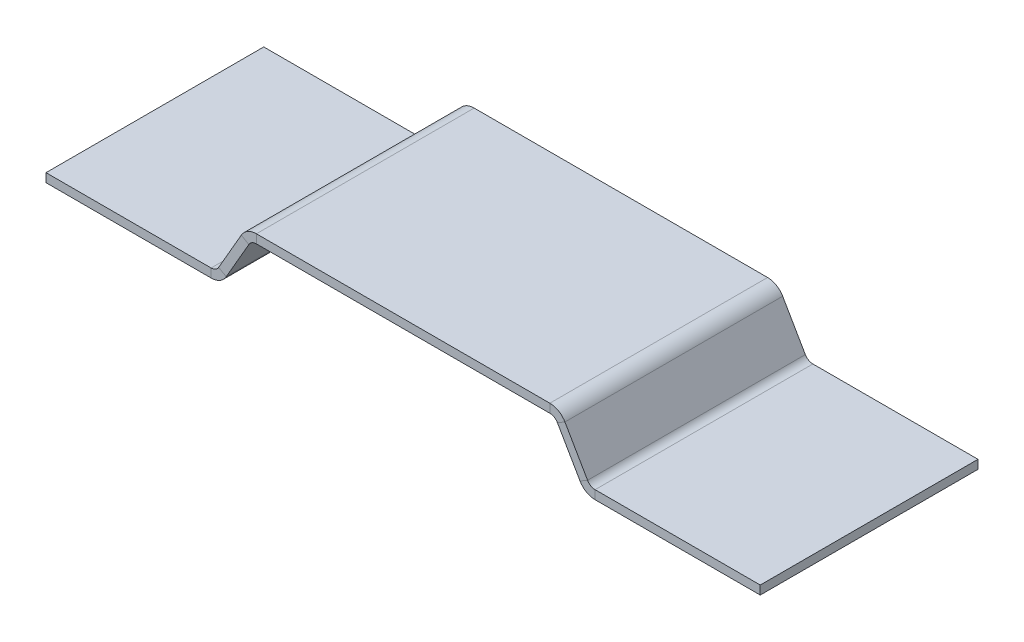
ISO-10303-21;
HEADER;
FILE_DESCRIPTION(('STEP AP214'),'2;1');
FILE_NAME('part.step','',(''),(''),'','','');
FILE_SCHEMA(('AUTOMOTIVE_DESIGN { 1 0 10303 214 1 1 1 1 }'));
ENDSEC;
DATA;
#1=APPLICATION_CONTEXT('core data for automotive mechanical design processes');
#2=APPLICATION_PROTOCOL_DEFINITION('international standard','automotive_design',2000,#1);
#3=PRODUCT_CONTEXT('',#1,'mechanical');
#4=PRODUCT('Part','Part','',(#3));
#5=PRODUCT_RELATED_PRODUCT_CATEGORY('part','',(#4));
#6=PRODUCT_DEFINITION_FORMATION('','',#4);
#7=PRODUCT_DEFINITION_CONTEXT('part definition',#1,'design');
#8=PRODUCT_DEFINITION('design','',#6,#7);
#9=PRODUCT_DEFINITION_SHAPE('','',#8);
#10=(LENGTH_UNIT() NAMED_UNIT(*) SI_UNIT(.MILLI.,.METRE.));
#11=(NAMED_UNIT(*) PLANE_ANGLE_UNIT() SI_UNIT($,.RADIAN.));
#12=(NAMED_UNIT(*) SI_UNIT($,.STERADIAN.) SOLID_ANGLE_UNIT());
#13=UNCERTAINTY_MEASURE_WITH_UNIT(LENGTH_MEASURE(1.E-05),#10,'distance_accuracy_value','');
#14=(GEOMETRIC_REPRESENTATION_CONTEXT(3) GLOBAL_UNCERTAINTY_ASSIGNED_CONTEXT((#13)) GLOBAL_UNIT_ASSIGNED_CONTEXT((#10,
#11,#12)) REPRESENTATION_CONTEXT('',''));
#15=CARTESIAN_POINT('',(0.,0.,0.));
#16=DIRECTION('',(0.,0.,1.));
#17=DIRECTION('',(1.,0.,0.));
#18=AXIS2_PLACEMENT_3D('',#15,#16,#17);
#19=CARTESIAN_POINT('',(220.414518843274,0.,125.));
#20=DIRECTION('',(0.,0.,1.));
#21=DIRECTION('',(1.,0.,0.));
#22=AXIS2_PLACEMENT_3D('',#19,#20,#21);
#23=PLANE('',#22);
#24=DIRECTION('',(0.,-1.,0.));
#25=VECTOR('',#24,1.);
#26=CARTESIAN_POINT('',(220.414518843274,0.,125.));
#27=LINE('',#26,#25);
#28=CARTESIAN_POINT('',(220.414518843274,0.,125.));
#29=VERTEX_POINT('',#28);
#30=CARTESIAN_POINT('',(220.414518843274,-9.99999999999994,125.));
#31=VERTEX_POINT('',#30);
#32=EDGE_CURVE('E11',#29,#31,#27,.T.);
#33=ORIENTED_EDGE('',*,*,#32,.F.);
#34=CARTESIAN_POINT('',(220.414518843274,10.0000000000001,125.));
#35=DIRECTION('',(0.,0.,1.));
#36=DIRECTION('',(1.,0.,0.));
#37=AXIS2_PLACEMENT_3D('',#34,#35,#36);
#38=CIRCLE('',#37,10.);
#39=CARTESIAN_POINT('',(211.754264805429,5.00000000000007,125.));
#40=VERTEX_POINT('',#39);
#41=EDGE_CURVE('E363',#29,#40,#38,.F.);
#42=ORIENTED_EDGE('',*,*,#41,.T.);
#43=DIRECTION('',(0.86602540378444,0.499999999999998,0.));
#44=VECTOR('',#43,1.);
#45=CARTESIAN_POINT('',(203.094010767585,0.,125.));
#46=LINE('',#45,#44);
#47=CARTESIAN_POINT('',(203.094010767585,0.,125.));
#48=VERTEX_POINT('',#47);
#49=EDGE_CURVE('E46',#48,#40,#46,.T.);
#50=ORIENTED_EDGE('',*,*,#49,.F.);
#51=CARTESIAN_POINT('',(220.414518843274,10.0000000000001,125.));
#52=DIRECTION('',(0.,0.,1.));
#53=DIRECTION('',(1.,0.,0.));
#54=AXIS2_PLACEMENT_3D('',#51,#52,#53);
#55=CIRCLE('',#54,20.);
#56=EDGE_CURVE('E438',#31,#48,#55,.F.);
#57=ORIENTED_EDGE('',*,*,#56,.F.);
#58=EDGE_LOOP('',(#33,#42,#50,#57));
#59=FACE_BOUND('',#58,.T.);
#60=ADVANCED_FACE('F38',(#59),#23,.T.);
#61=CARTESIAN_POINT('',(203.094010767585,0.,125.));
#62=DIRECTION('',(0.,0.,1.));
#63=DIRECTION('',(1.,0.,0.));
#64=AXIS2_PLACEMENT_3D('',#61,#62,#63);
#65=PLANE('',#64);
#66=DIRECTION('',(-1.,0.,0.));
#67=VECTOR('',#66,1.);
#68=CARTESIAN_POINT('',(214.641016151377,0.,125.));
#69=LINE('',#68,#67);
#70=CARTESIAN_POINT('',(410.,0.,125.));
#71=VERTEX_POINT('',#70);
#72=EDGE_CURVE('E367',#71,#29,#69,.T.);
#73=ORIENTED_EDGE('',*,*,#72,.T.);
#74=ORIENTED_EDGE('',*,*,#32,.T.);
#75=DIRECTION('',(-1.,0.,0.));
#76=VECTOR('',#75,1.);
#77=CARTESIAN_POINT('',(214.641016151377,-9.99999999999995,125.));
#78=LINE('',#77,#76);
#79=CARTESIAN_POINT('',(410.,-9.99999999999992,125.));
#80=VERTEX_POINT('',#79);
#81=EDGE_CURVE('E440',#80,#31,#78,.T.);
#82=ORIENTED_EDGE('',*,*,#81,.F.);
#83=DIRECTION('',(0.,-1.,0.));
#84=VECTOR('',#83,1.);
#85=CARTESIAN_POINT('',(410.,0.,125.));
#86=LINE('',#85,#84);
#87=EDGE_CURVE('E443',#71,#80,#86,.T.);
#88=ORIENTED_EDGE('',*,*,#87,.F.);
#89=EDGE_LOOP('',(#73,#74,#82,#88));
#90=FACE_BOUND('',#89,.T.);
#91=ADVANCED_FACE('F449',(#90),#65,.T.);
#92=CARTESIAN_POINT('',(211.754264805429,5.00000000000007,-125.));
#93=DIRECTION('',(0.,0.,-1.));
#94=DIRECTION('',(-1.,0.,0.));
#95=AXIS2_PLACEMENT_3D('',#92,#93,#94);
#96=PLANE('',#95);
#97=DIRECTION('',(-0.86602540378444,-0.499999999999998,0.));
#98=VECTOR('',#97,1.);
#99=CARTESIAN_POINT('',(211.754264805429,5.00000000000007,-125.));
#100=LINE('',#99,#98);
#101=CARTESIAN_POINT('',(211.754264805429,5.00000000000007,-125.));
#102=VERTEX_POINT('',#101);
#103=CARTESIAN_POINT('',(203.094010767585,0.,-125.));
#104=VERTEX_POINT('',#103);
#105=EDGE_CURVE('E347',#102,#104,#100,.T.);
#106=ORIENTED_EDGE('',*,*,#105,.F.);
#107=CARTESIAN_POINT('',(220.414518843274,10.0000000000001,-125.));
#108=DIRECTION('',(0.,0.,1.));
#109=DIRECTION('',(1.,0.,0.));
#110=AXIS2_PLACEMENT_3D('',#107,#108,#109);
#111=CIRCLE('',#110,10.);
#112=CARTESIAN_POINT('',(220.414518843274,0.,-125.));
#113=VERTEX_POINT('',#112);
#114=EDGE_CURVE('E263',#113,#102,#111,.F.);
#115=ORIENTED_EDGE('',*,*,#114,.F.);
#116=DIRECTION('',(0.,1.,0.));
#117=VECTOR('',#116,1.);
#118=CARTESIAN_POINT('',(220.414518843274,-9.99999999999994,-125.));
#119=LINE('',#118,#117);
#120=CARTESIAN_POINT('',(220.414518843274,-9.99999999999994,-125.));
#121=VERTEX_POINT('',#120);
#122=EDGE_CURVE('E345',#121,#113,#119,.T.);
#123=ORIENTED_EDGE('',*,*,#122,.F.);
#124=CARTESIAN_POINT('',(220.414518843274,10.0000000000001,-125.));
#125=DIRECTION('',(0.,0.,1.));
#126=DIRECTION('',(1.,0.,0.));
#127=AXIS2_PLACEMENT_3D('',#124,#125,#126);
#128=CIRCLE('',#127,20.);
#129=EDGE_CURVE('E251',#121,#104,#128,.F.);
#130=ORIENTED_EDGE('',*,*,#129,.T.);
#131=EDGE_LOOP('',(#106,#115,#123,#130));
#132=FACE_BOUND('',#131,.T.);
#133=ADVANCED_FACE('F456',(#132),#96,.T.);
#134=CARTESIAN_POINT('',(220.414518843274,-9.99999999999994,-125.));
#135=DIRECTION('',(0.,0.,-1.));
#136=DIRECTION('',(-1.,0.,0.));
#137=AXIS2_PLACEMENT_3D('',#134,#135,#136);
#138=PLANE('',#137);
#139=DIRECTION('',(-0.499999999999998,0.86602540378444,0.));
#140=VECTOR('',#139,1.);
#141=CARTESIAN_POINT('',(180.,60.,-125.));
#142=LINE('',#141,#140);
#143=CARTESIAN_POINT('',(185.773502691896,50.,-125.));
#144=VERTEX_POINT('',#143);
#145=EDGE_CURVE('E266',#102,#144,#142,.T.);
#146=ORIENTED_EDGE('',*,*,#145,.F.);
#147=ORIENTED_EDGE('',*,*,#105,.T.);
#148=DIRECTION('',(-0.499999999999998,0.86602540378444,0.));
#149=VECTOR('',#148,1.);
#150=CARTESIAN_POINT('',(171.339745962156,55.0000000000001,-125.));
#151=LINE('',#150,#149);
#152=CARTESIAN_POINT('',(177.113248654052,45.,-125.));
#153=VERTEX_POINT('',#152);
#154=EDGE_CURVE('E248',#104,#153,#151,.T.);
#155=ORIENTED_EDGE('',*,*,#154,.T.);
#156=DIRECTION('',(0.86602540378444,0.499999999999998,0.));
#157=VECTOR('',#156,1.);
#158=CARTESIAN_POINT('',(177.113248654052,45.,-125.));
#159=LINE('',#158,#157);
#160=EDGE_CURVE('E337',#153,#144,#159,.T.);
#161=ORIENTED_EDGE('',*,*,#160,.T.);
#162=EDGE_LOOP('',(#146,#147,#155,#161));
#163=FACE_BOUND('',#162,.T.);
#164=ADVANCED_FACE('F459',(#163),#138,.T.);
#165=CARTESIAN_POINT('',(185.773502691896,50.,125.));
#166=DIRECTION('',(0.,0.,1.));
#167=DIRECTION('',(1.,0.,0.));
#168=AXIS2_PLACEMENT_3D('',#165,#166,#167);
#169=PLANE('',#168);
#170=DIRECTION('',(-0.86602540378444,-0.499999999999998,0.));
#171=VECTOR('',#170,1.);
#172=CARTESIAN_POINT('',(185.773502691896,50.,125.));
#173=LINE('',#172,#171);
#174=CARTESIAN_POINT('',(185.773502691896,50.,125.));
#175=VERTEX_POINT('',#174);
#176=CARTESIAN_POINT('',(177.113248654052,45.,125.));
#177=VERTEX_POINT('',#176);
#178=EDGE_CURVE('E343',#175,#177,#173,.T.);
#179=ORIENTED_EDGE('',*,*,#178,.F.);
#180=CARTESIAN_POINT('',(168.452994616207,40.,125.));
#181=DIRECTION('',(0.,0.,-1.));
#182=DIRECTION('',(-1.,0.,0.));
#183=AXIS2_PLACEMENT_3D('',#180,#181,#182);
#184=CIRCLE('',#183,20.);
#185=CARTESIAN_POINT('',(168.452994616207,60.,125.));
#186=VERTEX_POINT('',#185);
#187=EDGE_CURVE('E375',#175,#186,#184,.F.);
#188=ORIENTED_EDGE('',*,*,#187,.T.);
#189=DIRECTION('',(0.,1.,0.));
#190=VECTOR('',#189,1.);
#191=CARTESIAN_POINT('',(168.452994616207,50.,125.));
#192=LINE('',#191,#190);
#193=CARTESIAN_POINT('',(168.452994616207,50.,125.));
#194=VERTEX_POINT('',#193);
#195=EDGE_CURVE('E341',#194,#186,#192,.T.);
#196=ORIENTED_EDGE('',*,*,#195,.F.);
#197=CARTESIAN_POINT('',(168.452994616207,40.,125.));
#198=DIRECTION('',(0.,0.,1.));
#199=DIRECTION('',(1.,0.,0.));
#200=AXIS2_PLACEMENT_3D('',#197,#198,#199);
#201=CIRCLE('',#200,10.);
#202=EDGE_CURVE('E434',#177,#194,#201,.T.);
#203=ORIENTED_EDGE('',*,*,#202,.F.);
#204=EDGE_LOOP('',(#179,#188,#196,#203));
#205=FACE_BOUND('',#204,.T.);
#206=ADVANCED_FACE('F479',(#205),#169,.T.);
#207=CARTESIAN_POINT('',(168.452994616207,50.,125.));
#208=DIRECTION('',(0.,0.,1.));
#209=DIRECTION('',(1.,0.,0.));
#210=AXIS2_PLACEMENT_3D('',#207,#208,#209);
#211=PLANE('',#210);
#212=DIRECTION('',(-0.499999999999998,0.86602540378444,0.));
#213=VECTOR('',#212,1.);
#214=CARTESIAN_POINT('',(180.,60.,125.));
#215=LINE('',#214,#213);
#216=EDGE_CURVE('E354',#40,#175,#215,.T.);
#217=ORIENTED_EDGE('',*,*,#216,.T.);
#218=ORIENTED_EDGE('',*,*,#178,.T.);
#219=DIRECTION('',(-0.499999999999998,0.86602540378444,0.));
#220=VECTOR('',#219,1.);
#221=CARTESIAN_POINT('',(171.339745962156,55.0000000000001,125.));
#222=LINE('',#221,#220);
#223=EDGE_CURVE('E357',#48,#177,#222,.T.);
#224=ORIENTED_EDGE('',*,*,#223,.F.);
#225=ORIENTED_EDGE('',*,*,#49,.T.);
#226=EDGE_LOOP('',(#217,#218,#224,#225));
#227=FACE_BOUND('',#226,.T.);
#228=ADVANCED_FACE('F352',(#227),#211,.T.);
#229=CARTESIAN_POINT('',(168.452994616207,60.,-125.));
#230=DIRECTION('',(0.,0.,-1.));
#231=DIRECTION('',(-1.,0.,0.));
#232=AXIS2_PLACEMENT_3D('',#229,#230,#231);
#233=PLANE('',#232);
#234=DIRECTION('',(0.,-1.,0.));
#235=VECTOR('',#234,1.);
#236=CARTESIAN_POINT('',(168.452994616207,60.,-125.));
#237=LINE('',#236,#235);
#238=CARTESIAN_POINT('',(168.452994616207,60.,-125.));
#239=VERTEX_POINT('',#238);
#240=CARTESIAN_POINT('',(168.452994616207,50.,-125.));
#241=VERTEX_POINT('',#240);
#242=EDGE_CURVE('E339',#239,#241,#237,.T.);
#243=ORIENTED_EDGE('',*,*,#242,.F.);
#244=CARTESIAN_POINT('',(168.452994616207,40.,-125.));
#245=DIRECTION('',(0.,0.,-1.));
#246=DIRECTION('',(-1.,0.,0.));
#247=AXIS2_PLACEMENT_3D('',#244,#245,#246);
#248=CIRCLE('',#247,20.);
#249=EDGE_CURVE('E269',#144,#239,#248,.F.);
#250=ORIENTED_EDGE('',*,*,#249,.F.);
#251=ORIENTED_EDGE('',*,*,#160,.F.);
#252=CARTESIAN_POINT('',(168.452994616207,40.,-125.));
#253=DIRECTION('',(0.,0.,1.));
#254=DIRECTION('',(1.,0.,0.));
#255=AXIS2_PLACEMENT_3D('',#252,#253,#254);
#256=CIRCLE('',#255,10.);
#257=EDGE_CURVE('E245',#153,#241,#256,.T.);
#258=ORIENTED_EDGE('',*,*,#257,.T.);
#259=EDGE_LOOP('',(#243,#250,#251,#258));
#260=FACE_BOUND('',#259,.T.);
#261=ADVANCED_FACE('F473',(#260),#233,.T.);
#262=CARTESIAN_POINT('',(177.113248654052,45.,-125.));
#263=DIRECTION('',(0.,0.,-1.));
#264=DIRECTION('',(-1.,0.,0.));
#265=AXIS2_PLACEMENT_3D('',#262,#263,#264);
#266=PLANE('',#265);
#267=DIRECTION('',(-1.,0.,0.));
#268=VECTOR('',#267,1.);
#269=CARTESIAN_POINT('',(-180.,60.,-125.));
#270=LINE('',#269,#268);
#271=CARTESIAN_POINT('',(-168.452994616207,60.,-125.));
#272=VERTEX_POINT('',#271);
#273=EDGE_CURVE('E272',#239,#272,#270,.T.);
#274=ORIENTED_EDGE('',*,*,#273,.F.);
#275=ORIENTED_EDGE('',*,*,#242,.T.);
#276=DIRECTION('',(-1.,0.,0.));
#277=VECTOR('',#276,1.);
#278=CARTESIAN_POINT('',(-180.,50.,-125.));
#279=LINE('',#278,#277);
#280=CARTESIAN_POINT('',(-168.452994616207,50.,-125.));
#281=VERTEX_POINT('',#280);
#282=EDGE_CURVE('E242',#241,#281,#279,.T.);
#283=ORIENTED_EDGE('',*,*,#282,.T.);
#284=DIRECTION('',(0.,1.,0.));
#285=VECTOR('',#284,1.);
#286=CARTESIAN_POINT('',(-168.452994616207,50.,-125.));
#287=LINE('',#286,#285);
#288=EDGE_CURVE('E333',#281,#272,#287,.T.);
#289=ORIENTED_EDGE('',*,*,#288,.T.);
#290=EDGE_LOOP('',(#274,#275,#283,#289));
#291=FACE_BOUND('',#290,.T.);
#292=ADVANCED_FACE('F483',(#291),#266,.T.);
#293=CARTESIAN_POINT('',(-168.452994616207,60.,125.));
#294=DIRECTION('',(0.,0.,1.));
#295=DIRECTION('',(1.,0.,0.));
#296=AXIS2_PLACEMENT_3D('',#293,#294,#295);
#297=PLANE('',#296);
#298=DIRECTION('',(0.,-1.,0.));
#299=VECTOR('',#298,1.);
#300=CARTESIAN_POINT('',(-168.452994616207,60.,125.));
#301=LINE('',#300,#299);
#302=CARTESIAN_POINT('',(-168.452994616207,60.,125.));
#303=VERTEX_POINT('',#302);
#304=CARTESIAN_POINT('',(-168.452994616207,50.,125.));
#305=VERTEX_POINT('',#304);
#306=EDGE_CURVE('E195',#303,#305,#301,.T.);
#307=ORIENTED_EDGE('',*,*,#306,.F.);
#308=CARTESIAN_POINT('',(-168.452994616207,40.,125.));
#309=DIRECTION('',(0.,0.,-1.));
#310=DIRECTION('',(-1.,0.,0.));
#311=AXIS2_PLACEMENT_3D('',#308,#309,#310);
#312=CIRCLE('',#311,20.);
#313=CARTESIAN_POINT('',(-185.773502691896,50.,125.));
#314=VERTEX_POINT('',#313);
#315=EDGE_CURVE('E199',#303,#314,#312,.F.);
#316=ORIENTED_EDGE('',*,*,#315,.T.);
#317=DIRECTION('',(-0.86602540378444,0.499999999999998,0.));
#318=VECTOR('',#317,1.);
#319=CARTESIAN_POINT('',(-177.113248654052,45.,125.));
#320=LINE('',#319,#318);
#321=CARTESIAN_POINT('',(-177.113248654052,45.,125.));
#322=VERTEX_POINT('',#321);
#323=EDGE_CURVE('E183',#322,#314,#320,.T.);
#324=ORIENTED_EDGE('',*,*,#323,.F.);
#325=CARTESIAN_POINT('',(-168.452994616207,40.,125.));
#326=DIRECTION('',(0.,0.,1.));
#327=DIRECTION('',(1.,0.,0.));
#328=AXIS2_PLACEMENT_3D('',#325,#326,#327);
#329=CIRCLE('',#328,10.);
#330=EDGE_CURVE('E396',#305,#322,#329,.T.);
#331=ORIENTED_EDGE('',*,*,#330,.F.);
#332=EDGE_LOOP('',(#307,#316,#324,#331));
#333=FACE_BOUND('',#332,.T.);
#334=ADVANCED_FACE('F201',(#333),#297,.T.);
#335=CARTESIAN_POINT('',(-177.113248654052,45.,125.));
#336=DIRECTION('',(0.,0.,1.));
#337=DIRECTION('',(1.,0.,0.));
#338=AXIS2_PLACEMENT_3D('',#335,#336,#337);
#339=PLANE('',#338);
#340=DIRECTION('',(-1.,0.,0.));
#341=VECTOR('',#340,1.);
#342=CARTESIAN_POINT('',(-180.,60.,125.));
#343=LINE('',#342,#341);
#344=EDGE_CURVE('E205',#186,#303,#343,.T.);
#345=ORIENTED_EDGE('',*,*,#344,.T.);
#346=ORIENTED_EDGE('',*,*,#306,.T.);
#347=DIRECTION('',(-1.,0.,0.));
#348=VECTOR('',#347,1.);
#349=CARTESIAN_POINT('',(-180.,50.,125.));
#350=LINE('',#349,#348);
#351=EDGE_CURVE('E431',#194,#305,#350,.T.);
#352=ORIENTED_EDGE('',*,*,#351,.F.);
#353=ORIENTED_EDGE('',*,*,#195,.T.);
#354=EDGE_LOOP('',(#345,#346,#352,#353));
#355=FACE_BOUND('',#354,.T.);
#356=ADVANCED_FACE('F383',(#355),#339,.T.);
#357=CARTESIAN_POINT('',(-185.773502691896,50.,-125.));
#358=DIRECTION('',(0.,0.,-1.));
#359=DIRECTION('',(-1.,0.,0.));
#360=AXIS2_PLACEMENT_3D('',#357,#358,#359);
#361=PLANE('',#360);
#362=DIRECTION('',(0.86602540378444,-0.499999999999998,0.));
#363=VECTOR('',#362,1.);
#364=CARTESIAN_POINT('',(-185.773502691896,50.,-125.));
#365=LINE('',#364,#363);
#366=CARTESIAN_POINT('',(-185.773502691896,50.,-125.));
#367=VERTEX_POINT('',#366);
#368=CARTESIAN_POINT('',(-177.113248654052,45.,-125.));
#369=VERTEX_POINT('',#368);
#370=EDGE_CURVE('E196',#367,#369,#365,.T.);
#371=ORIENTED_EDGE('',*,*,#370,.F.);
#372=CARTESIAN_POINT('',(-168.452994616207,40.,-125.));
#373=DIRECTION('',(0.,0.,-1.));
#374=DIRECTION('',(-1.,0.,0.));
#375=AXIS2_PLACEMENT_3D('',#372,#373,#374);
#376=CIRCLE('',#375,20.);
#377=EDGE_CURVE('E212',#272,#367,#376,.F.);
#378=ORIENTED_EDGE('',*,*,#377,.F.);
#379=ORIENTED_EDGE('',*,*,#288,.F.);
#380=CARTESIAN_POINT('',(-168.452994616207,40.,-125.));
#381=DIRECTION('',(0.,0.,1.));
#382=DIRECTION('',(1.,0.,0.));
#383=AXIS2_PLACEMENT_3D('',#380,#381,#382);
#384=CIRCLE('',#383,10.);
#385=EDGE_CURVE('E239',#281,#369,#384,.T.);
#386=ORIENTED_EDGE('',*,*,#385,.T.);
#387=EDGE_LOOP('',(#371,#378,#379,#386));
#388=FACE_BOUND('',#387,.T.);
#389=ADVANCED_FACE('F390',(#388),#361,.T.);
#390=CARTESIAN_POINT('',(-168.452994616207,50.,-125.));
#391=DIRECTION('',(0.,0.,-1.));
#392=DIRECTION('',(-1.,0.,0.));
#393=AXIS2_PLACEMENT_3D('',#390,#391,#392);
#394=PLANE('',#393);
#395=DIRECTION('',(-0.499999999999998,-0.86602540378444,0.));
#396=VECTOR('',#395,1.);
#397=CARTESIAN_POINT('',(-180.,60.,-125.));
#398=LINE('',#397,#396);
#399=CARTESIAN_POINT('',(-211.754264805429,5.00000000000002,-125.));
#400=VERTEX_POINT('',#399);
#401=EDGE_CURVE('E276',#367,#400,#398,.T.);
#402=ORIENTED_EDGE('',*,*,#401,.F.);
#403=ORIENTED_EDGE('',*,*,#370,.T.);
#404=DIRECTION('',(-0.499999999999998,-0.86602540378444,0.));
#405=VECTOR('',#404,1.);
#406=CARTESIAN_POINT('',(-171.339745962156,55.,-125.));
#407=LINE('',#406,#405);
#408=CARTESIAN_POINT('',(-203.094010767585,0.,-125.));
#409=VERTEX_POINT('',#408);
#410=EDGE_CURVE('E237',#369,#409,#407,.T.);
#411=ORIENTED_EDGE('',*,*,#410,.T.);
#412=DIRECTION('',(-0.86602540378444,0.499999999999998,0.));
#413=VECTOR('',#412,1.);
#414=CARTESIAN_POINT('',(-203.094010767585,0.,-125.));
#415=LINE('',#414,#413);
#416=EDGE_CURVE('E119',#409,#400,#415,.T.);
#417=ORIENTED_EDGE('',*,*,#416,.T.);
#418=EDGE_LOOP('',(#402,#403,#411,#417));
#419=FACE_BOUND('',#418,.T.);
#420=ADVANCED_FACE('F392',(#419),#394,.T.);
#421=CARTESIAN_POINT('',(-211.754264805429,5.00000000000002,125.));
#422=DIRECTION('',(0.,0.,1.));
#423=DIRECTION('',(1.,0.,0.));
#424=AXIS2_PLACEMENT_3D('',#421,#422,#423);
#425=PLANE('',#424);
#426=DIRECTION('',(0.86602540378444,-0.499999999999998,0.));
#427=VECTOR('',#426,1.);
#428=CARTESIAN_POINT('',(-211.754264805429,5.00000000000002,125.));
#429=LINE('',#428,#427);
#430=CARTESIAN_POINT('',(-211.754264805429,5.00000000000002,125.));
#431=VERTEX_POINT('',#430);
#432=CARTESIAN_POINT('',(-203.094010767585,0.,125.));
#433=VERTEX_POINT('',#432);
#434=EDGE_CURVE('E331',#431,#433,#429,.T.);
#435=ORIENTED_EDGE('',*,*,#434,.F.);
#436=CARTESIAN_POINT('',(-220.414518843274,10.,125.));
#437=DIRECTION('',(0.,0.,1.));
#438=DIRECTION('',(1.,0.,0.));
#439=AXIS2_PLACEMENT_3D('',#436,#437,#438);
#440=CIRCLE('',#439,10.);
#441=CARTESIAN_POINT('',(-220.414518843274,0.,125.));
#442=VERTEX_POINT('',#441);
#443=EDGE_CURVE('E220',#431,#442,#440,.F.);
#444=ORIENTED_EDGE('',*,*,#443,.T.);
#445=DIRECTION('',(0.,1.,0.));
#446=VECTOR('',#445,1.);
#447=CARTESIAN_POINT('',(-220.414518843274,-10.,125.));
#448=LINE('',#447,#446);
#449=CARTESIAN_POINT('',(-220.414518843274,-10.,125.));
#450=VERTEX_POINT('',#449);
#451=EDGE_CURVE('E54',#450,#442,#448,.T.);
#452=ORIENTED_EDGE('',*,*,#451,.F.);
#453=CARTESIAN_POINT('',(-220.414518843274,10.,125.));
#454=DIRECTION('',(0.,0.,1.));
#455=DIRECTION('',(1.,0.,0.));
#456=AXIS2_PLACEMENT_3D('',#453,#454,#455);
#457=CIRCLE('',#456,20.);
#458=EDGE_CURVE('E424',#433,#450,#457,.F.);
#459=ORIENTED_EDGE('',*,*,#458,.F.);
#460=EDGE_LOOP('',(#435,#444,#452,#459));
#461=FACE_BOUND('',#460,.T.);
#462=ADVANCED_FACE('F554',(#461),#425,.T.);
#463=CARTESIAN_POINT('',(-220.414518843274,-10.,125.));
#464=DIRECTION('',(0.,0.,1.));
#465=DIRECTION('',(1.,0.,0.));
#466=AXIS2_PLACEMENT_3D('',#463,#464,#465);
#467=PLANE('',#466);
#468=DIRECTION('',(-0.499999999999998,-0.86602540378444,0.));
#469=VECTOR('',#468,1.);
#470=CARTESIAN_POINT('',(-180.,60.,125.));
#471=LINE('',#470,#469);
#472=EDGE_CURVE('E187',#314,#431,#471,.T.);
#473=ORIENTED_EDGE('',*,*,#472,.T.);
#474=ORIENTED_EDGE('',*,*,#434,.T.);
#475=DIRECTION('',(-0.499999999999998,-0.86602540378444,0.));
#476=VECTOR('',#475,1.);
#477=CARTESIAN_POINT('',(-171.339745962156,55.,125.));
#478=LINE('',#477,#476);
#479=EDGE_CURVE('E190',#322,#433,#478,.T.);
#480=ORIENTED_EDGE('',*,*,#479,.F.);
#481=ORIENTED_EDGE('',*,*,#323,.T.);
#482=EDGE_LOOP('',(#473,#474,#480,#481));
#483=FACE_BOUND('',#482,.T.);
#484=ADVANCED_FACE('F185',(#483),#467,.T.);
#485=CARTESIAN_POINT('',(-220.414518843274,0.,-125.));
#486=DIRECTION('',(0.,0.,-1.));
#487=DIRECTION('',(-1.,0.,0.));
#488=AXIS2_PLACEMENT_3D('',#485,#486,#487);
#489=PLANE('',#488);
#490=DIRECTION('',(0.,-1.,0.));
#491=VECTOR('',#490,1.);
#492=CARTESIAN_POINT('',(-220.414518843274,0.,-125.));
#493=LINE('',#492,#491);
#494=CARTESIAN_POINT('',(-220.414518843274,0.,-125.));
#495=VERTEX_POINT('',#494);
#496=CARTESIAN_POINT('',(-220.414518843274,-10.,-125.));
#497=VERTEX_POINT('',#496);
#498=EDGE_CURVE('E126',#495,#497,#493,.T.);
#499=ORIENTED_EDGE('',*,*,#498,.F.);
#500=CARTESIAN_POINT('',(-220.414518843274,10.,-125.));
#501=DIRECTION('',(0.,0.,1.));
#502=DIRECTION('',(1.,0.,0.));
#503=AXIS2_PLACEMENT_3D('',#500,#501,#502);
#504=CIRCLE('',#503,10.);
#505=EDGE_CURVE('E278',#400,#495,#504,.F.);
#506=ORIENTED_EDGE('',*,*,#505,.F.);
#507=ORIENTED_EDGE('',*,*,#416,.F.);
#508=CARTESIAN_POINT('',(-220.414518843274,10.,-125.));
#509=DIRECTION('',(0.,0.,1.));
#510=DIRECTION('',(1.,0.,0.));
#511=AXIS2_PLACEMENT_3D('',#508,#509,#510);
#512=CIRCLE('',#511,20.);
#513=EDGE_CURVE('E235',#409,#497,#512,.F.);
#514=ORIENTED_EDGE('',*,*,#513,.T.);
#515=EDGE_LOOP('',(#499,#506,#507,#514));
#516=FACE_BOUND('',#515,.T.);
#517=ADVANCED_FACE('F407',(#516),#489,.T.);
#518=CARTESIAN_POINT('',(-203.094010767585,0.,-125.));
#519=DIRECTION('',(0.,0.,-1.));
#520=DIRECTION('',(-1.,0.,0.));
#521=AXIS2_PLACEMENT_3D('',#518,#519,#520);
#522=PLANE('',#521);
#523=DIRECTION('',(-1.,0.,0.));
#524=VECTOR('',#523,1.);
#525=CARTESIAN_POINT('',(-214.641016151377,0.,-125.));
#526=LINE('',#525,#524);
#527=CARTESIAN_POINT('',(-410.,0.,-125.));
#528=VERTEX_POINT('',#527);
#529=EDGE_CURVE('E226',#495,#528,#526,.T.);
#530=ORIENTED_EDGE('',*,*,#529,.F.);
#531=ORIENTED_EDGE('',*,*,#498,.T.);
#532=DIRECTION('',(-1.,0.,0.));
#533=VECTOR('',#532,1.);
#534=CARTESIAN_POINT('',(-214.641016151377,-10.,-125.));
#535=LINE('',#534,#533);
#536=CARTESIAN_POINT('',(-410.,-10.,-125.));
#537=VERTEX_POINT('',#536);
#538=EDGE_CURVE('E232',#497,#537,#535,.T.);
#539=ORIENTED_EDGE('',*,*,#538,.T.);
#540=DIRECTION('',(0.,1.,0.));
#541=VECTOR('',#540,1.);
#542=CARTESIAN_POINT('',(-410.,-10.,-125.));
#543=LINE('',#542,#541);
#544=EDGE_CURVE('E229',#537,#528,#543,.T.);
#545=ORIENTED_EDGE('',*,*,#544,.T.);
#546=EDGE_LOOP('',(#530,#531,#539,#545));
#547=FACE_BOUND('',#546,.T.);
#548=ADVANCED_FACE('F415',(#547),#522,.T.);
#549=CARTESIAN_POINT('',(-214.641016151377,0.,125.));
#550=DIRECTION('',(0.,-1.,0.));
#551=DIRECTION('',(1.,0.,0.));
#552=AXIS2_PLACEMENT_3D('',#549,#550,#551);
#553=PLANE('',#552);
#554=ORIENTED_EDGE('',*,*,#529,.T.);
#555=DIRECTION('',(0.,0.,-1.));
#556=VECTOR('',#555,1.);
#557=CARTESIAN_POINT('',(-410.,0.,125.));
#558=LINE('',#557,#556);
#559=CARTESIAN_POINT('',(-410.,0.,125.));
#560=VERTEX_POINT('',#559);
#561=EDGE_CURVE('E326',#560,#528,#558,.T.);
#562=ORIENTED_EDGE('',*,*,#561,.F.);
#563=DIRECTION('',(-1.,0.,0.));
#564=VECTOR('',#563,1.);
#565=CARTESIAN_POINT('',(-214.641016151377,0.,125.));
#566=LINE('',#565,#564);
#567=EDGE_CURVE('E132',#442,#560,#566,.T.);
#568=ORIENTED_EDGE('',*,*,#567,.F.);
#569=DIRECTION('',(0.,0.,-1.));
#570=VECTOR('',#569,1.);
#571=CARTESIAN_POINT('',(-220.414518843274,0.,125.));
#572=LINE('',#571,#570);
#573=EDGE_CURVE('E222',#442,#495,#572,.T.);
#574=ORIENTED_EDGE('',*,*,#573,.T.);
#575=EDGE_LOOP('',(#554,#562,#568,#574));
#576=FACE_BOUND('',#575,.T.);
#577=ADVANCED_FACE('F413',(#576),#553,.F.);
#578=CARTESIAN_POINT('',(-410.,-10.,125.));
#579=DIRECTION('',(-1.,0.,0.));
#580=DIRECTION('',(0.,0.,1.));
#581=AXIS2_PLACEMENT_3D('',#578,#579,#580);
#582=PLANE('',#581);
#583=ORIENTED_EDGE('',*,*,#544,.F.);
#584=DIRECTION('',(0.,0.,-1.));
#585=VECTOR('',#584,1.);
#586=CARTESIAN_POINT('',(-410.,-10.,125.));
#587=LINE('',#586,#585);
#588=CARTESIAN_POINT('',(-410.,-10.,125.));
#589=VERTEX_POINT('',#588);
#590=EDGE_CURVE('E324',#589,#537,#587,.T.);
#591=ORIENTED_EDGE('',*,*,#590,.F.);
#592=DIRECTION('',(0.,1.,0.));
#593=VECTOR('',#592,1.);
#594=CARTESIAN_POINT('',(-410.,-10.,125.));
#595=LINE('',#594,#593);
#596=EDGE_CURVE('E420',#589,#560,#595,.T.);
#597=ORIENTED_EDGE('',*,*,#596,.T.);
#598=ORIENTED_EDGE('',*,*,#561,.T.);
#599=EDGE_LOOP('',(#583,#591,#597,#598));
#600=FACE_BOUND('',#599,.T.);
#601=ADVANCED_FACE('F418',(#600),#582,.T.);
#602=CARTESIAN_POINT('',(-214.641016151377,-10.,125.));
#603=DIRECTION('',(0.,-1.,0.));
#604=DIRECTION('',(1.,0.,0.));
#605=AXIS2_PLACEMENT_3D('',#602,#603,#604);
#606=PLANE('',#605);
#607=ORIENTED_EDGE('',*,*,#538,.F.);
#608=DIRECTION('',(0.,0.,-1.));
#609=VECTOR('',#608,1.);
#610=CARTESIAN_POINT('',(-220.414518843274,-10.,125.));
#611=LINE('',#610,#609);
#612=EDGE_CURVE('E321',#450,#497,#611,.T.);
#613=ORIENTED_EDGE('',*,*,#612,.F.);
#614=DIRECTION('',(-1.,0.,0.));
#615=VECTOR('',#614,1.);
#616=CARTESIAN_POINT('',(-214.641016151377,-10.,125.));
#617=LINE('',#616,#615);
#618=EDGE_CURVE('E422',#450,#589,#617,.T.);
#619=ORIENTED_EDGE('',*,*,#618,.T.);
#620=ORIENTED_EDGE('',*,*,#590,.T.);
#621=EDGE_LOOP('',(#607,#613,#619,#620));
#622=FACE_BOUND('',#621,.T.);
#623=ADVANCED_FACE('F610',(#622),#606,.T.);
#624=CARTESIAN_POINT('',(-220.414518843274,10.,125.));
#625=DIRECTION('',(0.,0.,-1.));
#626=DIRECTION('',(-1.,0.,0.));
#627=AXIS2_PLACEMENT_3D('',#624,#625,#626);
#628=CYLINDRICAL_SURFACE('',#627,20.);
#629=ORIENTED_EDGE('',*,*,#513,.F.);
#630=DIRECTION('',(0.,0.,-1.));
#631=VECTOR('',#630,1.);
#632=CARTESIAN_POINT('',(-203.094010767585,0.,125.));
#633=LINE('',#632,#631);
#634=EDGE_CURVE('E318',#433,#409,#633,.T.);
#635=ORIENTED_EDGE('',*,*,#634,.F.);
#636=ORIENTED_EDGE('',*,*,#458,.T.);
#637=ORIENTED_EDGE('',*,*,#612,.T.);
#638=EDGE_LOOP('',(#629,#635,#636,#637));
#639=FACE_BOUND('',#638,.T.);
#640=ADVANCED_FACE('F404',(#639),#628,.T.);
#641=CARTESIAN_POINT('',(-171.339745962156,55.,125.));
#642=DIRECTION('',(0.86602540378444,-0.499999999999998,0.));
#643=DIRECTION('',(0.499999999999998,0.86602540378444,0.));
#644=AXIS2_PLACEMENT_3D('',#641,#642,#643);
#645=PLANE('',#644);
#646=ORIENTED_EDGE('',*,*,#410,.F.);
#647=DIRECTION('',(0.,0.,-1.));
#648=VECTOR('',#647,1.);
#649=CARTESIAN_POINT('',(-177.113248654052,45.,125.));
#650=LINE('',#649,#648);
#651=EDGE_CURVE('E315',#322,#369,#650,.T.);
#652=ORIENTED_EDGE('',*,*,#651,.F.);
#653=ORIENTED_EDGE('',*,*,#479,.T.);
#654=ORIENTED_EDGE('',*,*,#634,.T.);
#655=EDGE_LOOP('',(#646,#652,#653,#654));
#656=FACE_BOUND('',#655,.T.);
#657=ADVANCED_FACE('F398',(#656),#645,.T.);
#658=CARTESIAN_POINT('',(-168.452994616207,40.,125.));
#659=DIRECTION('',(0.,0.,-1.));
#660=DIRECTION('',(-1.,0.,0.));
#661=AXIS2_PLACEMENT_3D('',#658,#659,#660);
#662=CYLINDRICAL_SURFACE('',#661,10.);
#663=ORIENTED_EDGE('',*,*,#385,.F.);
#664=DIRECTION('',(0.,0.,-1.));
#665=VECTOR('',#664,1.);
#666=CARTESIAN_POINT('',(-168.452994616207,50.,125.));
#667=LINE('',#666,#665);
#668=EDGE_CURVE('E312',#305,#281,#667,.T.);
#669=ORIENTED_EDGE('',*,*,#668,.F.);
#670=ORIENTED_EDGE('',*,*,#330,.T.);
#671=ORIENTED_EDGE('',*,*,#651,.T.);
#672=EDGE_LOOP('',(#663,#669,#670,#671));
#673=FACE_BOUND('',#672,.T.);
#674=ADVANCED_FACE('F395',(#673),#662,.F.);
#675=CARTESIAN_POINT('',(-180.,50.,125.));
#676=DIRECTION('',(0.,-1.,0.));
#677=DIRECTION('',(1.,0.,0.));
#678=AXIS2_PLACEMENT_3D('',#675,#676,#677);
#679=PLANE('',#678);
#680=ORIENTED_EDGE('',*,*,#282,.F.);
#681=DIRECTION('',(0.,0.,-1.));
#682=VECTOR('',#681,1.);
#683=CARTESIAN_POINT('',(168.452994616207,50.,125.));
#684=LINE('',#683,#682);
#685=EDGE_CURVE('E309',#194,#241,#684,.T.);
#686=ORIENTED_EDGE('',*,*,#685,.F.);
#687=ORIENTED_EDGE('',*,*,#351,.T.);
#688=ORIENTED_EDGE('',*,*,#668,.T.);
#689=EDGE_LOOP('',(#680,#686,#687,#688));
#690=FACE_BOUND('',#689,.T.);
#691=ADVANCED_FACE('F481',(#690),#679,.T.);
#692=CARTESIAN_POINT('',(168.452994616207,40.,125.));
#693=DIRECTION('',(0.,0.,-1.));
#694=DIRECTION('',(-1.,0.,0.));
#695=AXIS2_PLACEMENT_3D('',#692,#693,#694);
#696=CYLINDRICAL_SURFACE('',#695,10.);
#697=ORIENTED_EDGE('',*,*,#257,.F.);
#698=DIRECTION('',(0.,0.,-1.));
#699=VECTOR('',#698,1.);
#700=CARTESIAN_POINT('',(177.113248654052,45.,125.));
#701=LINE('',#700,#699);
#702=EDGE_CURVE('E306',#177,#153,#701,.T.);
#703=ORIENTED_EDGE('',*,*,#702,.F.);
#704=ORIENTED_EDGE('',*,*,#202,.T.);
#705=ORIENTED_EDGE('',*,*,#685,.T.);
#706=EDGE_LOOP('',(#697,#703,#704,#705));
#707=FACE_BOUND('',#706,.T.);
#708=ADVANCED_FACE('F469',(#707),#696,.F.);
#709=CARTESIAN_POINT('',(171.339745962156,55.0000000000001,125.));
#710=DIRECTION('',(-0.86602540378444,-0.499999999999998,0.));
#711=DIRECTION('',(0.499999999999998,-0.86602540378444,0.));
#712=AXIS2_PLACEMENT_3D('',#709,#710,#711);
#713=PLANE('',#712);
#714=ORIENTED_EDGE('',*,*,#154,.F.);
#715=DIRECTION('',(0.,0.,-1.));
#716=VECTOR('',#715,1.);
#717=CARTESIAN_POINT('',(203.094010767585,0.,125.));
#718=LINE('',#717,#716);
#719=EDGE_CURVE('E303',#48,#104,#718,.T.);
#720=ORIENTED_EDGE('',*,*,#719,.F.);
#721=ORIENTED_EDGE('',*,*,#223,.T.);
#722=ORIENTED_EDGE('',*,*,#702,.T.);
#723=EDGE_LOOP('',(#714,#720,#721,#722));
#724=FACE_BOUND('',#723,.T.);
#725=ADVANCED_FACE('F464',(#724),#713,.T.);
#726=CARTESIAN_POINT('',(220.414518843274,10.0000000000001,125.));
#727=DIRECTION('',(0.,0.,-1.));
#728=DIRECTION('',(-1.,0.,0.));
#729=AXIS2_PLACEMENT_3D('',#726,#727,#728);
#730=CYLINDRICAL_SURFACE('',#729,20.);
#731=ORIENTED_EDGE('',*,*,#129,.F.);
#732=DIRECTION('',(0.,0.,-1.));
#733=VECTOR('',#732,1.);
#734=CARTESIAN_POINT('',(220.414518843274,-9.99999999999994,125.));
#735=LINE('',#734,#733);
#736=EDGE_CURVE('E300',#31,#121,#735,.T.);
#737=ORIENTED_EDGE('',*,*,#736,.F.);
#738=ORIENTED_EDGE('',*,*,#56,.T.);
#739=ORIENTED_EDGE('',*,*,#719,.T.);
#740=EDGE_LOOP('',(#731,#737,#738,#739));
#741=FACE_BOUND('',#740,.T.);
#742=ADVANCED_FACE('F462',(#741),#730,.T.);
#743=CARTESIAN_POINT('',(214.641016151377,-9.99999999999995,125.));
#744=DIRECTION('',(0.,-1.,0.));
#745=DIRECTION('',(1.,0.,0.));
#746=AXIS2_PLACEMENT_3D('',#743,#744,#745);
#747=PLANE('',#746);
#748=DIRECTION('',(-1.,0.,0.));
#749=VECTOR('',#748,1.);
#750=CARTESIAN_POINT('',(214.641016151377,-9.99999999999995,-125.));
#751=LINE('',#750,#749);
#752=CARTESIAN_POINT('',(410.,-9.99999999999992,-125.));
#753=VERTEX_POINT('',#752);
#754=EDGE_CURVE('E254',#753,#121,#751,.T.);
#755=ORIENTED_EDGE('',*,*,#754,.F.);
#756=DIRECTION('',(0.,0.,-1.));
#757=VECTOR('',#756,1.);
#758=CARTESIAN_POINT('',(410.,-9.99999999999992,125.));
#759=LINE('',#758,#757);
#760=EDGE_CURVE('E298',#80,#753,#759,.T.);
#761=ORIENTED_EDGE('',*,*,#760,.F.);
#762=ORIENTED_EDGE('',*,*,#81,.T.);
#763=ORIENTED_EDGE('',*,*,#736,.T.);
#764=EDGE_LOOP('',(#755,#761,#762,#763));
#765=FACE_BOUND('',#764,.T.);
#766=ADVANCED_FACE('F684',(#765),#747,.T.);
#767=CARTESIAN_POINT('',(410.,0.,125.));
#768=DIRECTION('',(1.,0.,0.));
#769=DIRECTION('',(0.,0.,-1.));
#770=AXIS2_PLACEMENT_3D('',#767,#768,#769);
#771=PLANE('',#770);
#772=DIRECTION('',(0.,-1.,0.));
#773=VECTOR('',#772,1.);
#774=CARTESIAN_POINT('',(410.,0.,-125.));
#775=LINE('',#774,#773);
#776=CARTESIAN_POINT('',(410.,0.,-125.));
#777=VERTEX_POINT('',#776);
#778=EDGE_CURVE('E257',#777,#753,#775,.T.);
#779=ORIENTED_EDGE('',*,*,#778,.F.);
#780=DIRECTION('',(0.,0.,-1.));
#781=VECTOR('',#780,1.);
#782=CARTESIAN_POINT('',(410.,0.,125.));
#783=LINE('',#782,#781);
#784=EDGE_CURVE('E296',#71,#777,#783,.T.);
#785=ORIENTED_EDGE('',*,*,#784,.F.);
#786=ORIENTED_EDGE('',*,*,#87,.T.);
#787=ORIENTED_EDGE('',*,*,#760,.T.);
#788=EDGE_LOOP('',(#779,#785,#786,#787));
#789=FACE_BOUND('',#788,.T.);
#790=ADVANCED_FACE('F694',(#789),#771,.T.);
#791=CARTESIAN_POINT('',(214.641016151377,0.,125.));
#792=DIRECTION('',(0.,-1.,0.));
#793=DIRECTION('',(1.,0.,0.));
#794=AXIS2_PLACEMENT_3D('',#791,#792,#793);
#795=PLANE('',#794);
#796=DIRECTION('',(-1.,0.,0.));
#797=VECTOR('',#796,1.);
#798=CARTESIAN_POINT('',(214.641016151377,0.,-125.));
#799=LINE('',#798,#797);
#800=EDGE_CURVE('E260',#777,#113,#799,.T.);
#801=ORIENTED_EDGE('',*,*,#800,.T.);
#802=DIRECTION('',(0.,0.,-1.));
#803=VECTOR('',#802,1.);
#804=CARTESIAN_POINT('',(220.414518843274,0.,125.));
#805=LINE('',#804,#803);
#806=EDGE_CURVE('E293',#29,#113,#805,.T.);
#807=ORIENTED_EDGE('',*,*,#806,.F.);
#808=ORIENTED_EDGE('',*,*,#72,.F.);
#809=ORIENTED_EDGE('',*,*,#784,.T.);
#810=EDGE_LOOP('',(#801,#807,#808,#809));
#811=FACE_BOUND('',#810,.T.);
#812=ADVANCED_FACE('F453',(#811),#795,.F.);
#813=CARTESIAN_POINT('',(220.414518843274,10.0000000000001,125.));
#814=DIRECTION('',(0.,0.,-1.));
#815=DIRECTION('',(-1.,0.,0.));
#816=AXIS2_PLACEMENT_3D('',#813,#814,#815);
#817=CYLINDRICAL_SURFACE('',#816,10.);
#818=ORIENTED_EDGE('',*,*,#114,.T.);
#819=DIRECTION('',(0.,0.,-1.));
#820=VECTOR('',#819,1.);
#821=CARTESIAN_POINT('',(211.754264805429,5.00000000000007,125.));
#822=LINE('',#821,#820);
#823=EDGE_CURVE('E290',#40,#102,#822,.T.);
#824=ORIENTED_EDGE('',*,*,#823,.F.);
#825=ORIENTED_EDGE('',*,*,#41,.F.);
#826=ORIENTED_EDGE('',*,*,#806,.T.);
#827=EDGE_LOOP('',(#818,#824,#825,#826));
#828=FACE_BOUND('',#827,.T.);
#829=ADVANCED_FACE('F369',(#828),#817,.F.);
#830=CARTESIAN_POINT('',(180.,60.,125.));
#831=DIRECTION('',(-0.86602540378444,-0.499999999999998,0.));
#832=DIRECTION('',(0.499999999999998,-0.86602540378444,0.));
#833=AXIS2_PLACEMENT_3D('',#830,#831,#832);
#834=PLANE('',#833);
#835=ORIENTED_EDGE('',*,*,#145,.T.);
#836=DIRECTION('',(0.,0.,-1.));
#837=VECTOR('',#836,1.);
#838=CARTESIAN_POINT('',(185.773502691896,50.,125.));
#839=LINE('',#838,#837);
#840=EDGE_CURVE('E287',#175,#144,#839,.T.);
#841=ORIENTED_EDGE('',*,*,#840,.F.);
#842=ORIENTED_EDGE('',*,*,#216,.F.);
#843=ORIENTED_EDGE('',*,*,#823,.T.);
#844=EDGE_LOOP('',(#835,#841,#842,#843));
#845=FACE_BOUND('',#844,.T.);
#846=ADVANCED_FACE('F373',(#845),#834,.F.);
#847=CARTESIAN_POINT('',(168.452994616207,40.,125.));
#848=DIRECTION('',(0.,0.,-1.));
#849=DIRECTION('',(-1.,0.,0.));
#850=AXIS2_PLACEMENT_3D('',#847,#848,#849);
#851=CYLINDRICAL_SURFACE('',#850,20.);
#852=ORIENTED_EDGE('',*,*,#249,.T.);
#853=DIRECTION('',(0.,0.,-1.));
#854=VECTOR('',#853,1.);
#855=CARTESIAN_POINT('',(168.452994616207,60.,125.));
#856=LINE('',#855,#854);
#857=EDGE_CURVE('E284',#186,#239,#856,.T.);
#858=ORIENTED_EDGE('',*,*,#857,.F.);
#859=ORIENTED_EDGE('',*,*,#187,.F.);
#860=ORIENTED_EDGE('',*,*,#840,.T.);
#861=EDGE_LOOP('',(#852,#858,#859,#860));
#862=FACE_BOUND('',#861,.T.);
#863=ADVANCED_FACE('F476',(#862),#851,.T.);
#864=CARTESIAN_POINT('',(-180.,60.,125.));
#865=DIRECTION('',(0.,-1.,0.));
#866=DIRECTION('',(1.,0.,0.));
#867=AXIS2_PLACEMENT_3D('',#864,#865,#866);
#868=PLANE('',#867);
#869=ORIENTED_EDGE('',*,*,#273,.T.);
#870=DIRECTION('',(0.,0.,-1.));
#871=VECTOR('',#870,1.);
#872=CARTESIAN_POINT('',(-168.452994616207,60.,125.));
#873=LINE('',#872,#871);
#874=EDGE_CURVE('E214',#303,#272,#873,.T.);
#875=ORIENTED_EDGE('',*,*,#874,.F.);
#876=ORIENTED_EDGE('',*,*,#344,.F.);
#877=ORIENTED_EDGE('',*,*,#857,.T.);
#878=EDGE_LOOP('',(#869,#875,#876,#877));
#879=FACE_BOUND('',#878,.T.);
#880=ADVANCED_FACE('F387',(#879),#868,.F.);
#881=CARTESIAN_POINT('',(-168.452994616207,40.,125.));
#882=DIRECTION('',(0.,0.,-1.));
#883=DIRECTION('',(-1.,0.,0.));
#884=AXIS2_PLACEMENT_3D('',#881,#882,#883);
#885=CYLINDRICAL_SURFACE('',#884,20.);
#886=ORIENTED_EDGE('',*,*,#377,.T.);
#887=DIRECTION('',(0.,0.,-1.));
#888=VECTOR('',#887,1.);
#889=CARTESIAN_POINT('',(-185.773502691896,50.,125.));
#890=LINE('',#889,#888);
#891=EDGE_CURVE('E209',#314,#367,#890,.T.);
#892=ORIENTED_EDGE('',*,*,#891,.F.);
#893=ORIENTED_EDGE('',*,*,#315,.F.);
#894=ORIENTED_EDGE('',*,*,#874,.T.);
#895=EDGE_LOOP('',(#886,#892,#893,#894));
#896=FACE_BOUND('',#895,.T.);
#897=ADVANCED_FACE('F210',(#896),#885,.T.);
#898=CARTESIAN_POINT('',(-180.,60.,125.));
#899=DIRECTION('',(0.86602540378444,-0.499999999999998,0.));
#900=DIRECTION('',(0.499999999999998,0.86602540378444,0.));
#901=AXIS2_PLACEMENT_3D('',#898,#899,#900);
#902=PLANE('',#901);
#903=ORIENTED_EDGE('',*,*,#401,.T.);
#904=DIRECTION('',(0.,0.,-1.));
#905=VECTOR('',#904,1.);
#906=CARTESIAN_POINT('',(-211.754264805429,5.00000000000002,125.));
#907=LINE('',#906,#905);
#908=EDGE_CURVE('E215',#431,#400,#907,.T.);
#909=ORIENTED_EDGE('',*,*,#908,.F.);
#910=ORIENTED_EDGE('',*,*,#472,.F.);
#911=ORIENTED_EDGE('',*,*,#891,.T.);
#912=EDGE_LOOP('',(#903,#909,#910,#911));
#913=FACE_BOUND('',#912,.T.);
#914=ADVANCED_FACE('F217',(#913),#902,.F.);
#915=CARTESIAN_POINT('',(-220.414518843274,10.,125.));
#916=DIRECTION('',(0.,0.,-1.));
#917=DIRECTION('',(-1.,0.,0.));
#918=AXIS2_PLACEMENT_3D('',#915,#916,#917);
#919=CYLINDRICAL_SURFACE('',#918,10.);
#920=ORIENTED_EDGE('',*,*,#505,.T.);
#921=ORIENTED_EDGE('',*,*,#573,.F.);
#922=ORIENTED_EDGE('',*,*,#443,.F.);
#923=ORIENTED_EDGE('',*,*,#908,.T.);
#924=EDGE_LOOP('',(#920,#921,#922,#923));
#925=FACE_BOUND('',#924,.T.);
#926=ADVANCED_FACE('F410',(#925),#919,.F.);
#927=CARTESIAN_POINT('',(-220.414518843274,10.,125.));
#928=DIRECTION('',(0.,0.,1.));
#929=DIRECTION('',(1.,0.,0.));
#930=AXIS2_PLACEMENT_3D('',#927,#928,#929);
#931=PLANE('',#930);
#932=ORIENTED_EDGE('',*,*,#567,.T.);
#933=ORIENTED_EDGE('',*,*,#596,.F.);
#934=ORIENTED_EDGE('',*,*,#618,.F.);
#935=ORIENTED_EDGE('',*,*,#451,.T.);
#936=EDGE_LOOP('',(#932,#933,#934,#935));
#937=FACE_BOUND('',#936,.T.);
#938=ADVANCED_FACE('F778',(#937),#931,.T.);
#939=CARTESIAN_POINT('',(-220.414518843274,10.,-125.));
#940=DIRECTION('',(0.,0.,1.));
#941=DIRECTION('',(1.,0.,0.));
#942=AXIS2_PLACEMENT_3D('',#939,#940,#941);
#943=PLANE('',#942);
#944=ORIENTED_EDGE('',*,*,#754,.T.);
#945=ORIENTED_EDGE('',*,*,#122,.T.);
#946=ORIENTED_EDGE('',*,*,#800,.F.);
#947=ORIENTED_EDGE('',*,*,#778,.T.);
#948=EDGE_LOOP('',(#944,#945,#946,#947));
#949=FACE_BOUND('',#948,.T.);
#950=ADVANCED_FACE('F788',(#949),#943,.F.);
#951=CLOSED_SHELL('',(#60,#91,#133,#164,#206,#228,#261,#292,#334,#356,#389,#420,#462,#484,#517,
#548,#577,#601,#623,#640,#657,#674,#691,#708,#725,#742,#766,#790,#812,#829,#846,#863,#880,#897,
#914,#926,#938,#950));
#952=MANIFOLD_SOLID_BREP('B2',#951);
#953=ADVANCED_BREP_SHAPE_REPRESENTATION('',(#18,#952),#14);
#954=SHAPE_DEFINITION_REPRESENTATION(#9,#953);
ENDSEC;
END-ISO-10303-21;
